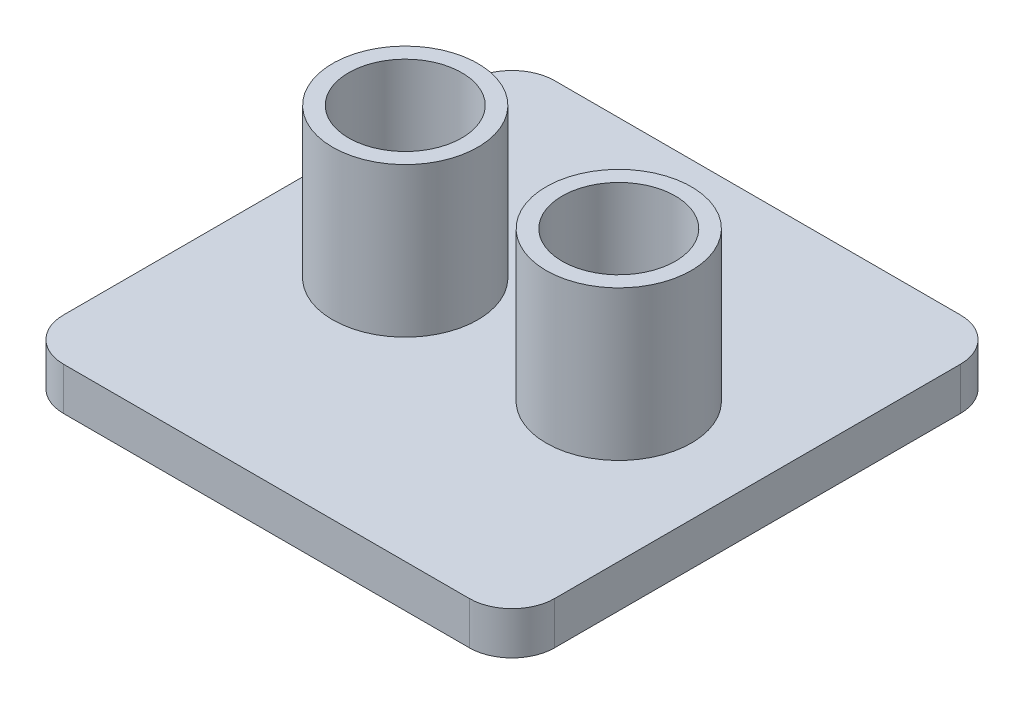
ISO-10303-21;
HEADER;
FILE_DESCRIPTION(('STEP AP214'),'2;1');
FILE_NAME('part.step','',(''),(''),'','','');
FILE_SCHEMA(('AUTOMOTIVE_DESIGN { 1 0 10303 214 1 1 1 1 }'));
ENDSEC;
DATA;
#1=APPLICATION_CONTEXT('core data for automotive mechanical design processes');
#2=APPLICATION_PROTOCOL_DEFINITION('international standard','automotive_design',2000,#1);
#3=PRODUCT_CONTEXT('',#1,'mechanical');
#4=PRODUCT('Part','Part','',(#3));
#5=PRODUCT_RELATED_PRODUCT_CATEGORY('part','',(#4));
#6=PRODUCT_DEFINITION_FORMATION('','',#4);
#7=PRODUCT_DEFINITION_CONTEXT('part definition',#1,'design');
#8=PRODUCT_DEFINITION('design','',#6,#7);
#9=PRODUCT_DEFINITION_SHAPE('','',#8);
#10=(LENGTH_UNIT() NAMED_UNIT(*) SI_UNIT(.MILLI.,.METRE.));
#11=(NAMED_UNIT(*) PLANE_ANGLE_UNIT() SI_UNIT($,.RADIAN.));
#12=(NAMED_UNIT(*) SI_UNIT($,.STERADIAN.) SOLID_ANGLE_UNIT());
#13=UNCERTAINTY_MEASURE_WITH_UNIT(LENGTH_MEASURE(1.E-05),#10,'distance_accuracy_value','');
#14=(GEOMETRIC_REPRESENTATION_CONTEXT(3) GLOBAL_UNCERTAINTY_ASSIGNED_CONTEXT((#13)) GLOBAL_UNIT_ASSIGNED_CONTEXT((#10,
#11,#12)) REPRESENTATION_CONTEXT('',''));
#15=CARTESIAN_POINT('',(0.,0.,0.));
#16=DIRECTION('',(0.,0.,1.));
#17=DIRECTION('',(1.,0.,0.));
#18=AXIS2_PLACEMENT_3D('',#15,#16,#17);
#19=CARTESIAN_POINT('',(-9.5,2.,9.5));
#20=DIRECTION('',(0.,-1.,0.));
#21=DIRECTION('',(0.,0.,-1.));
#22=AXIS2_PLACEMENT_3D('',#19,#20,#21);
#23=CYLINDRICAL_SURFACE('',#22,2.);
#24=CARTESIAN_POINT('',(-9.5,0.,9.5));
#25=DIRECTION('',(0.,1.,0.));
#26=DIRECTION('',(0.,0.,1.));
#27=AXIS2_PLACEMENT_3D('',#24,#25,#26);
#28=CIRCLE('',#27,2.);
#29=CARTESIAN_POINT('',(-11.5,0.,9.5));
#30=VERTEX_POINT('',#29);
#31=CARTESIAN_POINT('',(-9.5,0.,11.5));
#32=VERTEX_POINT('',#31);
#33=EDGE_CURVE('E146',#30,#32,#28,.T.);
#34=ORIENTED_EDGE('',*,*,#33,.T.);
#35=DIRECTION('',(0.,-1.,0.));
#36=VECTOR('',#35,1.);
#37=CARTESIAN_POINT('',(-9.5,2.,11.5));
#38=LINE('',#37,#36);
#39=CARTESIAN_POINT('',(-9.5,2.,11.5));
#40=VERTEX_POINT('',#39);
#41=EDGE_CURVE('E46',#40,#32,#38,.T.);
#42=ORIENTED_EDGE('',*,*,#41,.F.);
#43=CARTESIAN_POINT('',(-9.5,2.,9.5));
#44=DIRECTION('',(0.,1.,0.));
#45=DIRECTION('',(0.,0.,1.));
#46=AXIS2_PLACEMENT_3D('',#43,#44,#45);
#47=CIRCLE('',#46,2.);
#48=CARTESIAN_POINT('',(-11.5,2.,9.5));
#49=VERTEX_POINT('',#48);
#50=EDGE_CURVE('E169',#49,#40,#47,.T.);
#51=ORIENTED_EDGE('',*,*,#50,.F.);
#52=DIRECTION('',(0.,-1.,0.));
#53=VECTOR('',#52,1.);
#54=CARTESIAN_POINT('',(-11.5,2.,9.5));
#55=LINE('',#54,#53);
#56=EDGE_CURVE('E142',#49,#30,#55,.T.);
#57=ORIENTED_EDGE('',*,*,#56,.T.);
#58=EDGE_LOOP('',(#34,#42,#51,#57));
#59=FACE_BOUND('',#58,.T.);
#60=ADVANCED_FACE('F43',(#59),#23,.T.);
#61=CARTESIAN_POINT('',(-9.5,2.,11.5));
#62=DIRECTION('',(0.,0.,-1.));
#63=DIRECTION('',(-1.,0.,0.));
#64=AXIS2_PLACEMENT_3D('',#61,#62,#63);
#65=PLANE('',#64);
#66=DIRECTION('',(1.,0.,0.));
#67=VECTOR('',#66,1.);
#68=CARTESIAN_POINT('',(-9.5,0.,11.5));
#69=LINE('',#68,#67);
#70=CARTESIAN_POINT('',(9.5,0.,11.5));
#71=VERTEX_POINT('',#70);
#72=EDGE_CURVE('E150',#32,#71,#69,.T.);
#73=ORIENTED_EDGE('',*,*,#72,.T.);
#74=DIRECTION('',(0.,-1.,0.));
#75=VECTOR('',#74,1.);
#76=CARTESIAN_POINT('',(9.5,2.,11.5));
#77=LINE('',#76,#75);
#78=CARTESIAN_POINT('',(9.5,2.,11.5));
#79=VERTEX_POINT('',#78);
#80=EDGE_CURVE('E183',#79,#71,#77,.T.);
#81=ORIENTED_EDGE('',*,*,#80,.F.);
#82=DIRECTION('',(1.,0.,0.));
#83=VECTOR('',#82,1.);
#84=CARTESIAN_POINT('',(-9.5,2.,11.5));
#85=LINE('',#84,#83);
#86=EDGE_CURVE('E105',#40,#79,#85,.T.);
#87=ORIENTED_EDGE('',*,*,#86,.F.);
#88=ORIENTED_EDGE('',*,*,#41,.T.);
#89=EDGE_LOOP('',(#73,#81,#87,#88));
#90=FACE_BOUND('',#89,.T.);
#91=ADVANCED_FACE('F191',(#90),#65,.F.);
#92=CARTESIAN_POINT('',(9.5,2.,9.5));
#93=DIRECTION('',(0.,-1.,0.));
#94=DIRECTION('',(0.,0.,-1.));
#95=AXIS2_PLACEMENT_3D('',#92,#93,#94);
#96=CYLINDRICAL_SURFACE('',#95,2.);
#97=CARTESIAN_POINT('',(9.5,0.,9.5));
#98=DIRECTION('',(0.,1.,0.));
#99=DIRECTION('',(0.,0.,-1.));
#100=AXIS2_PLACEMENT_3D('',#97,#98,#99);
#101=CIRCLE('',#100,2.);
#102=CARTESIAN_POINT('',(11.5,0.,9.5));
#103=VERTEX_POINT('',#102);
#104=EDGE_CURVE('E154',#71,#103,#101,.T.);
#105=ORIENTED_EDGE('',*,*,#104,.T.);
#106=DIRECTION('',(0.,-1.,0.));
#107=VECTOR('',#106,1.);
#108=CARTESIAN_POINT('',(11.5,2.,9.5));
#109=LINE('',#108,#107);
#110=CARTESIAN_POINT('',(11.5,2.,9.5));
#111=VERTEX_POINT('',#110);
#112=EDGE_CURVE('E180',#111,#103,#109,.T.);
#113=ORIENTED_EDGE('',*,*,#112,.F.);
#114=CARTESIAN_POINT('',(9.5,2.,9.5));
#115=DIRECTION('',(0.,1.,0.));
#116=DIRECTION('',(0.,0.,-1.));
#117=AXIS2_PLACEMENT_3D('',#114,#115,#116);
#118=CIRCLE('',#117,2.);
#119=EDGE_CURVE('E207',#79,#111,#118,.T.);
#120=ORIENTED_EDGE('',*,*,#119,.F.);
#121=ORIENTED_EDGE('',*,*,#80,.T.);
#122=EDGE_LOOP('',(#105,#113,#120,#121));
#123=FACE_BOUND('',#122,.T.);
#124=ADVANCED_FACE('F200',(#123),#96,.T.);
#125=CARTESIAN_POINT('',(11.5,2.,9.5));
#126=DIRECTION('',(-1.,0.,0.));
#127=DIRECTION('',(0.,0.,1.));
#128=AXIS2_PLACEMENT_3D('',#125,#126,#127);
#129=PLANE('',#128);
#130=DIRECTION('',(0.,0.,-1.));
#131=VECTOR('',#130,1.);
#132=CARTESIAN_POINT('',(11.5,0.,9.5));
#133=LINE('',#132,#131);
#134=CARTESIAN_POINT('',(11.5,0.,-9.5));
#135=VERTEX_POINT('',#134);
#136=EDGE_CURVE('E157',#103,#135,#133,.T.);
#137=ORIENTED_EDGE('',*,*,#136,.T.);
#138=DIRECTION('',(0.,-1.,0.));
#139=VECTOR('',#138,1.);
#140=CARTESIAN_POINT('',(11.5,2.,-9.5));
#141=LINE('',#140,#139);
#142=CARTESIAN_POINT('',(11.5,2.,-9.5));
#143=VERTEX_POINT('',#142);
#144=EDGE_CURVE('E176',#143,#135,#141,.T.);
#145=ORIENTED_EDGE('',*,*,#144,.F.);
#146=DIRECTION('',(0.,0.,-1.));
#147=VECTOR('',#146,1.);
#148=CARTESIAN_POINT('',(11.5,2.,9.5));
#149=LINE('',#148,#147);
#150=EDGE_CURVE('E205',#111,#143,#149,.T.);
#151=ORIENTED_EDGE('',*,*,#150,.F.);
#152=ORIENTED_EDGE('',*,*,#112,.T.);
#153=EDGE_LOOP('',(#137,#145,#151,#152));
#154=FACE_BOUND('',#153,.T.);
#155=ADVANCED_FACE('F203',(#154),#129,.F.);
#156=CARTESIAN_POINT('',(9.5,2.,-9.5));
#157=DIRECTION('',(0.,-1.,0.));
#158=DIRECTION('',(0.,0.,-1.));
#159=AXIS2_PLACEMENT_3D('',#156,#157,#158);
#160=CYLINDRICAL_SURFACE('',#159,2.);
#161=CARTESIAN_POINT('',(9.5,0.,-9.5));
#162=DIRECTION('',(0.,1.,0.));
#163=DIRECTION('',(0.,0.,1.));
#164=AXIS2_PLACEMENT_3D('',#161,#162,#163);
#165=CIRCLE('',#164,2.);
#166=CARTESIAN_POINT('',(9.5,0.,-11.5));
#167=VERTEX_POINT('',#166);
#168=EDGE_CURVE('E160',#135,#167,#165,.T.);
#169=ORIENTED_EDGE('',*,*,#168,.T.);
#170=DIRECTION('',(0.,-1.,0.));
#171=VECTOR('',#170,1.);
#172=CARTESIAN_POINT('',(9.5,2.,-11.5));
#173=LINE('',#172,#171);
#174=CARTESIAN_POINT('',(9.5,2.,-11.5));
#175=VERTEX_POINT('',#174);
#176=EDGE_CURVE('E135',#175,#167,#173,.T.);
#177=ORIENTED_EDGE('',*,*,#176,.F.);
#178=CARTESIAN_POINT('',(9.5,2.,-9.5));
#179=DIRECTION('',(0.,1.,0.));
#180=DIRECTION('',(0.,0.,1.));
#181=AXIS2_PLACEMENT_3D('',#178,#179,#180);
#182=CIRCLE('',#181,2.);
#183=EDGE_CURVE('E124',#143,#175,#182,.T.);
#184=ORIENTED_EDGE('',*,*,#183,.F.);
#185=ORIENTED_EDGE('',*,*,#144,.T.);
#186=EDGE_LOOP('',(#169,#177,#184,#185));
#187=FACE_BOUND('',#186,.T.);
#188=ADVANCED_FACE('F289',(#187),#160,.T.);
#189=CARTESIAN_POINT('',(-9.5,2.,-11.5));
#190=DIRECTION('',(0.,0.,1.));
#191=DIRECTION('',(1.,0.,0.));
#192=AXIS2_PLACEMENT_3D('',#189,#190,#191);
#193=PLANE('',#192);
#194=DIRECTION('',(-1.,0.,0.));
#195=VECTOR('',#194,1.);
#196=CARTESIAN_POINT('',(-9.5,0.,-11.5));
#197=LINE('',#196,#195);
#198=CARTESIAN_POINT('',(-9.5,0.,-11.5));
#199=VERTEX_POINT('',#198);
#200=EDGE_CURVE('E133',#167,#199,#197,.T.);
#201=ORIENTED_EDGE('',*,*,#200,.T.);
#202=DIRECTION('',(0.,-1.,0.));
#203=VECTOR('',#202,1.);
#204=CARTESIAN_POINT('',(-9.5,2.,-11.5));
#205=LINE('',#204,#203);
#206=CARTESIAN_POINT('',(-9.5,2.,-11.5));
#207=VERTEX_POINT('',#206);
#208=EDGE_CURVE('E130',#207,#199,#205,.T.);
#209=ORIENTED_EDGE('',*,*,#208,.F.);
#210=DIRECTION('',(-1.,0.,0.));
#211=VECTOR('',#210,1.);
#212=CARTESIAN_POINT('',(-9.5,2.,-11.5));
#213=LINE('',#212,#211);
#214=EDGE_CURVE('E118',#175,#207,#213,.T.);
#215=ORIENTED_EDGE('',*,*,#214,.F.);
#216=ORIENTED_EDGE('',*,*,#176,.T.);
#217=EDGE_LOOP('',(#201,#209,#215,#216));
#218=FACE_BOUND('',#217,.T.);
#219=ADVANCED_FACE('F131',(#218),#193,.F.);
#220=CARTESIAN_POINT('',(-9.5,2.,-9.5));
#221=DIRECTION('',(0.,-1.,0.));
#222=DIRECTION('',(0.,0.,-1.));
#223=AXIS2_PLACEMENT_3D('',#220,#221,#222);
#224=CYLINDRICAL_SURFACE('',#223,2.);
#225=CARTESIAN_POINT('',(-9.5,0.,-9.5));
#226=DIRECTION('',(0.,1.,0.));
#227=DIRECTION('',(0.,0.,1.));
#228=AXIS2_PLACEMENT_3D('',#225,#226,#227);
#229=CIRCLE('',#228,2.);
#230=CARTESIAN_POINT('',(-11.5,0.,-9.5));
#231=VERTEX_POINT('',#230);
#232=EDGE_CURVE('E90',#199,#231,#229,.T.);
#233=ORIENTED_EDGE('',*,*,#232,.T.);
#234=DIRECTION('',(0.,-1.,0.));
#235=VECTOR('',#234,1.);
#236=CARTESIAN_POINT('',(-11.5,2.,-9.5));
#237=LINE('',#236,#235);
#238=CARTESIAN_POINT('',(-11.5,2.,-9.5));
#239=VERTEX_POINT('',#238);
#240=EDGE_CURVE('E136',#239,#231,#237,.T.);
#241=ORIENTED_EDGE('',*,*,#240,.F.);
#242=CARTESIAN_POINT('',(-9.5,2.,-9.5));
#243=DIRECTION('',(0.,1.,0.));
#244=DIRECTION('',(0.,0.,1.));
#245=AXIS2_PLACEMENT_3D('',#242,#243,#244);
#246=CIRCLE('',#245,2.);
#247=EDGE_CURVE('E122',#207,#239,#246,.T.);
#248=ORIENTED_EDGE('',*,*,#247,.F.);
#249=ORIENTED_EDGE('',*,*,#208,.T.);
#250=EDGE_LOOP('',(#233,#241,#248,#249));
#251=FACE_BOUND('',#250,.T.);
#252=ADVANCED_FACE('F138',(#251),#224,.T.);
#253=CARTESIAN_POINT('',(-11.5,2.,9.5));
#254=DIRECTION('',(1.,0.,0.));
#255=DIRECTION('',(0.,0.,-1.));
#256=AXIS2_PLACEMENT_3D('',#253,#254,#255);
#257=PLANE('',#256);
#258=DIRECTION('',(0.,0.,1.));
#259=VECTOR('',#258,1.);
#260=CARTESIAN_POINT('',(-11.5,0.,9.5));
#261=LINE('',#260,#259);
#262=EDGE_CURVE('E96',#231,#30,#261,.T.);
#263=ORIENTED_EDGE('',*,*,#262,.T.);
#264=ORIENTED_EDGE('',*,*,#56,.F.);
#265=DIRECTION('',(0.,0.,1.));
#266=VECTOR('',#265,1.);
#267=CARTESIAN_POINT('',(-11.5,2.,9.5));
#268=LINE('',#267,#266);
#269=EDGE_CURVE('E61',#239,#49,#268,.T.);
#270=ORIENTED_EDGE('',*,*,#269,.F.);
#271=ORIENTED_EDGE('',*,*,#240,.T.);
#272=EDGE_LOOP('',(#263,#264,#270,#271));
#273=FACE_BOUND('',#272,.T.);
#274=ADVANCED_FACE('F268',(#273),#257,.F.);
#275=CARTESIAN_POINT('',(-9.5,2.,9.5));
#276=DIRECTION('',(0.,1.,0.));
#277=DIRECTION('',(0.,0.,1.));
#278=AXIS2_PLACEMENT_3D('',#275,#276,#277);
#279=PLANE('',#278);
#280=CARTESIAN_POINT('',(5.,2.,0.));
#281=DIRECTION('',(0.,1.,0.));
#282=DIRECTION('',(0.,0.,1.));
#283=AXIS2_PLACEMENT_3D('',#280,#281,#282);
#284=CIRCLE('',#283,3.4);
#285=CARTESIAN_POINT('',(5.,2.,3.4));
#286=VERTEX_POINT('',#285);
#287=EDGE_CURVE('E220',#286,#286,#284,.T.);
#288=ORIENTED_EDGE('',*,*,#287,.F.);
#289=EDGE_LOOP('',(#288));
#290=FACE_BOUND('',#289,.T.);
#291=CARTESIAN_POINT('',(-5.,2.,0.));
#292=DIRECTION('',(0.,1.,0.));
#293=DIRECTION('',(0.,0.,1.));
#294=AXIS2_PLACEMENT_3D('',#291,#292,#293);
#295=CIRCLE('',#294,3.4);
#296=CARTESIAN_POINT('',(-5.,2.,3.4));
#297=VERTEX_POINT('',#296);
#298=EDGE_CURVE('E11',#297,#297,#295,.T.);
#299=ORIENTED_EDGE('',*,*,#298,.F.);
#300=EDGE_LOOP('',(#299));
#301=FACE_BOUND('',#300,.T.);
#302=ORIENTED_EDGE('',*,*,#50,.T.);
#303=ORIENTED_EDGE('',*,*,#86,.T.);
#304=ORIENTED_EDGE('',*,*,#119,.T.);
#305=ORIENTED_EDGE('',*,*,#150,.T.);
#306=ORIENTED_EDGE('',*,*,#183,.T.);
#307=ORIENTED_EDGE('',*,*,#214,.T.);
#308=ORIENTED_EDGE('',*,*,#247,.T.);
#309=ORIENTED_EDGE('',*,*,#269,.T.);
#310=EDGE_LOOP('',(#302,#303,#304,#305,#306,#307,#308,#309));
#311=FACE_BOUND('',#310,.T.);
#312=ADVANCED_FACE('F120',(#290,#301,#311),#279,.T.);
#313=CARTESIAN_POINT('',(-9.5,0.,9.5));
#314=DIRECTION('',(0.,1.,0.));
#315=DIRECTION('',(0.,0.,1.));
#316=AXIS2_PLACEMENT_3D('',#313,#314,#315);
#317=PLANE('',#316);
#318=CARTESIAN_POINT('',(-5.,0.,0.));
#319=DIRECTION('',(0.,1.,0.));
#320=DIRECTION('',(0.,0.,1.));
#321=AXIS2_PLACEMENT_3D('',#318,#319,#320);
#322=CIRCLE('',#321,2.65);
#323=CARTESIAN_POINT('',(-5.,0.,2.65));
#324=VERTEX_POINT('',#323);
#325=EDGE_CURVE('E225',#324,#324,#322,.T.);
#326=ORIENTED_EDGE('',*,*,#325,.T.);
#327=EDGE_LOOP('',(#326));
#328=FACE_BOUND('',#327,.T.);
#329=CARTESIAN_POINT('',(5.,0.,0.));
#330=DIRECTION('',(0.,1.,0.));
#331=DIRECTION('',(0.,0.,1.));
#332=AXIS2_PLACEMENT_3D('',#329,#330,#331);
#333=CIRCLE('',#332,2.65);
#334=CARTESIAN_POINT('',(5.,0.,2.65));
#335=VERTEX_POINT('',#334);
#336=EDGE_CURVE('E229',#335,#335,#333,.T.);
#337=ORIENTED_EDGE('',*,*,#336,.T.);
#338=EDGE_LOOP('',(#337));
#339=FACE_BOUND('',#338,.T.);
#340=ORIENTED_EDGE('',*,*,#33,.F.);
#341=ORIENTED_EDGE('',*,*,#262,.F.);
#342=ORIENTED_EDGE('',*,*,#232,.F.);
#343=ORIENTED_EDGE('',*,*,#200,.F.);
#344=ORIENTED_EDGE('',*,*,#168,.F.);
#345=ORIENTED_EDGE('',*,*,#136,.F.);
#346=ORIENTED_EDGE('',*,*,#104,.F.);
#347=ORIENTED_EDGE('',*,*,#72,.F.);
#348=EDGE_LOOP('',(#340,#341,#342,#343,#344,#345,#346,#347));
#349=FACE_BOUND('',#348,.T.);
#350=ADVANCED_FACE('F196',(#328,#339,#349),#317,.F.);
#351=CARTESIAN_POINT('',(-5.,9.,0.));
#352=DIRECTION('',(0.,-1.,0.));
#353=DIRECTION('',(0.,0.,-1.));
#354=AXIS2_PLACEMENT_3D('',#351,#352,#353);
#355=CYLINDRICAL_SURFACE('',#354,3.4);
#356=CARTESIAN_POINT('',(-5.,9.,0.));
#357=DIRECTION('',(0.,1.,0.));
#358=DIRECTION('',(0.,0.,1.));
#359=AXIS2_PLACEMENT_3D('',#356,#357,#358);
#360=CIRCLE('',#359,3.4);
#361=CARTESIAN_POINT('',(-5.,9.,3.4));
#362=VERTEX_POINT('',#361);
#363=EDGE_CURVE('E151',#362,#362,#360,.T.);
#364=ORIENTED_EDGE('',*,*,#363,.F.);
#365=EDGE_LOOP('',(#364));
#366=FACE_BOUND('',#365,.T.);
#367=ORIENTED_EDGE('',*,*,#298,.T.);
#368=EDGE_LOOP('',(#367));
#369=FACE_BOUND('',#368,.T.);
#370=ADVANCED_FACE('F258',(#366,#369),#355,.T.);
#371=CARTESIAN_POINT('',(-5.,9.,0.));
#372=DIRECTION('',(0.,1.,0.));
#373=DIRECTION('',(0.,0.,1.));
#374=AXIS2_PLACEMENT_3D('',#371,#372,#373);
#375=PLANE('',#374);
#376=CARTESIAN_POINT('',(-5.,9.,0.));
#377=DIRECTION('',(0.,1.,0.));
#378=DIRECTION('',(0.,0.,1.));
#379=AXIS2_PLACEMENT_3D('',#376,#377,#378);
#380=CIRCLE('',#379,2.65);
#381=CARTESIAN_POINT('',(-5.,9.,2.65));
#382=VERTEX_POINT('',#381);
#383=EDGE_CURVE('E237',#382,#382,#380,.T.);
#384=ORIENTED_EDGE('',*,*,#383,.F.);
#385=EDGE_LOOP('',(#384));
#386=FACE_BOUND('',#385,.T.);
#387=ORIENTED_EDGE('',*,*,#363,.T.);
#388=EDGE_LOOP('',(#387));
#389=FACE_BOUND('',#388,.T.);
#390=ADVANCED_FACE('F254',(#386,#389),#375,.T.);
#391=CARTESIAN_POINT('',(5.,9.,0.));
#392=DIRECTION('',(0.,-1.,0.));
#393=DIRECTION('',(0.,0.,-1.));
#394=AXIS2_PLACEMENT_3D('',#391,#392,#393);
#395=CYLINDRICAL_SURFACE('',#394,3.4);
#396=CARTESIAN_POINT('',(5.,9.,0.));
#397=DIRECTION('',(0.,1.,0.));
#398=DIRECTION('',(0.,0.,1.));
#399=AXIS2_PLACEMENT_3D('',#396,#397,#398);
#400=CIRCLE('',#399,3.4);
#401=CARTESIAN_POINT('',(5.,9.,3.4));
#402=VERTEX_POINT('',#401);
#403=EDGE_CURVE('E221',#402,#402,#400,.T.);
#404=ORIENTED_EDGE('',*,*,#403,.F.);
#405=EDGE_LOOP('',(#404));
#406=FACE_BOUND('',#405,.T.);
#407=ORIENTED_EDGE('',*,*,#287,.T.);
#408=EDGE_LOOP('',(#407));
#409=FACE_BOUND('',#408,.T.);
#410=ADVANCED_FACE('F257',(#406,#409),#395,.T.);
#411=CARTESIAN_POINT('',(5.,9.,0.));
#412=DIRECTION('',(0.,1.,0.));
#413=DIRECTION('',(0.,0.,1.));
#414=AXIS2_PLACEMENT_3D('',#411,#412,#413);
#415=PLANE('',#414);
#416=CARTESIAN_POINT('',(5.,9.,0.));
#417=DIRECTION('',(0.,1.,0.));
#418=DIRECTION('',(0.,0.,1.));
#419=AXIS2_PLACEMENT_3D('',#416,#417,#418);
#420=CIRCLE('',#419,2.65);
#421=CARTESIAN_POINT('',(5.,9.,2.65));
#422=VERTEX_POINT('',#421);
#423=EDGE_CURVE('E233',#422,#422,#420,.T.);
#424=ORIENTED_EDGE('',*,*,#423,.F.);
#425=EDGE_LOOP('',(#424));
#426=FACE_BOUND('',#425,.T.);
#427=ORIENTED_EDGE('',*,*,#403,.T.);
#428=EDGE_LOOP('',(#427));
#429=FACE_BOUND('',#428,.T.);
#430=ADVANCED_FACE('F328',(#426,#429),#415,.T.);
#431=CARTESIAN_POINT('',(5.,0.,0.));
#432=DIRECTION('',(0.,1.,0.));
#433=DIRECTION('',(0.,0.,1.));
#434=AXIS2_PLACEMENT_3D('',#431,#432,#433);
#435=CYLINDRICAL_SURFACE('',#434,2.65);
#436=ORIENTED_EDGE('',*,*,#336,.F.);
#437=EDGE_LOOP('',(#436));
#438=FACE_BOUND('',#437,.T.);
#439=ORIENTED_EDGE('',*,*,#423,.T.);
#440=EDGE_LOOP('',(#439));
#441=FACE_BOUND('',#440,.T.);
#442=ADVANCED_FACE('F250',(#438,#441),#435,.F.);
#443=CARTESIAN_POINT('',(-5.,0.,0.));
#444=DIRECTION('',(0.,1.,0.));
#445=DIRECTION('',(0.,0.,1.));
#446=AXIS2_PLACEMENT_3D('',#443,#444,#445);
#447=CYLINDRICAL_SURFACE('',#446,2.65);
#448=ORIENTED_EDGE('',*,*,#325,.F.);
#449=EDGE_LOOP('',(#448));
#450=FACE_BOUND('',#449,.T.);
#451=ORIENTED_EDGE('',*,*,#383,.T.);
#452=EDGE_LOOP('',(#451));
#453=FACE_BOUND('',#452,.T.);
#454=ADVANCED_FACE('F247',(#450,#453),#447,.F.);
#455=CLOSED_SHELL('',(#60,#91,#124,#155,#188,#219,#252,#274,#312,#350,#370,#390,#410,#430,#442,#454));
#456=MANIFOLD_SOLID_BREP('B2',#455);
#457=ADVANCED_BREP_SHAPE_REPRESENTATION('',(#18,#456),#14);
#458=SHAPE_DEFINITION_REPRESENTATION(#9,#457);
ENDSEC;
END-ISO-10303-21;
